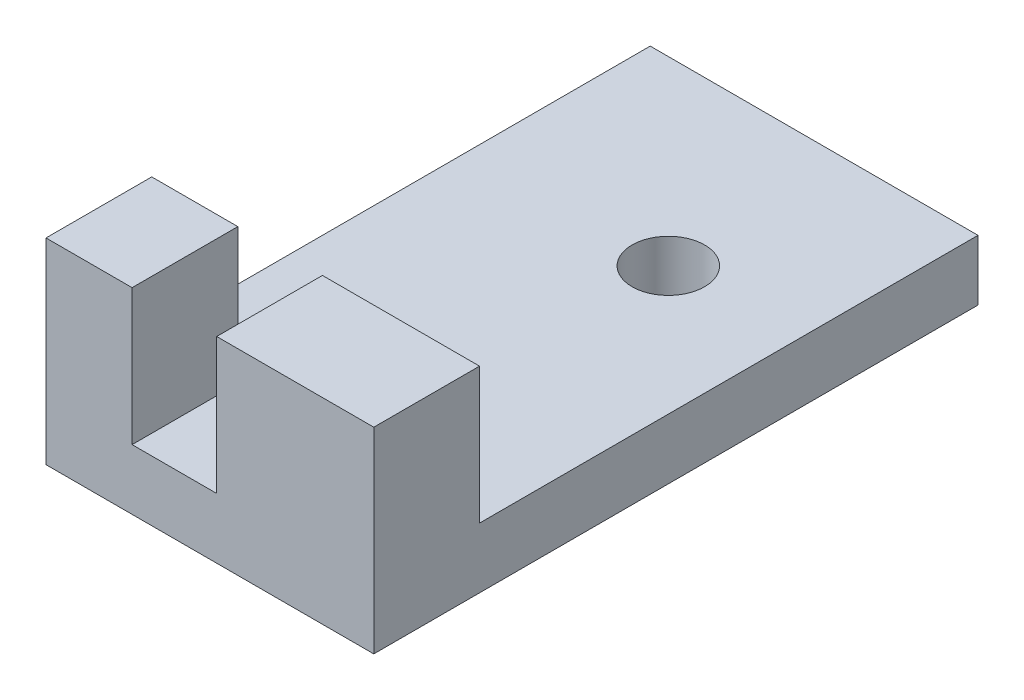
ISO-10303-21;
HEADER;
FILE_DESCRIPTION(('STEP AP214'),'2;1');
FILE_NAME('part.step','',(''),(''),'','','');
FILE_SCHEMA(('AUTOMOTIVE_DESIGN { 1 0 10303 214 1 1 1 1 }'));
ENDSEC;
DATA;
#1=APPLICATION_CONTEXT('core data for automotive mechanical design processes');
#2=APPLICATION_PROTOCOL_DEFINITION('international standard','automotive_design',2000,#1);
#3=PRODUCT_CONTEXT('',#1,'mechanical');
#4=PRODUCT('Part','Part','',(#3));
#5=PRODUCT_RELATED_PRODUCT_CATEGORY('part','',(#4));
#6=PRODUCT_DEFINITION_FORMATION('','',#4);
#7=PRODUCT_DEFINITION_CONTEXT('part definition',#1,'design');
#8=PRODUCT_DEFINITION('design','',#6,#7);
#9=PRODUCT_DEFINITION_SHAPE('','',#8);
#10=(LENGTH_UNIT() NAMED_UNIT(*) SI_UNIT(.MILLI.,.METRE.));
#11=(NAMED_UNIT(*) PLANE_ANGLE_UNIT() SI_UNIT($,.RADIAN.));
#12=(NAMED_UNIT(*) SI_UNIT($,.STERADIAN.) SOLID_ANGLE_UNIT());
#13=UNCERTAINTY_MEASURE_WITH_UNIT(LENGTH_MEASURE(1.E-05),#10,'distance_accuracy_value','');
#14=(GEOMETRIC_REPRESENTATION_CONTEXT(3) GLOBAL_UNCERTAINTY_ASSIGNED_CONTEXT((#13)) GLOBAL_UNIT_ASSIGNED_CONTEXT((#10,
#11,#12)) REPRESENTATION_CONTEXT('',''));
#15=CARTESIAN_POINT('',(0.,0.,0.));
#16=DIRECTION('',(0.,0.,1.));
#17=DIRECTION('',(1.,0.,0.));
#18=AXIS2_PLACEMENT_3D('',#15,#16,#17);
#19=CARTESIAN_POINT('',(0.,13.,0.));
#20=DIRECTION('',(0.,1.,0.));
#21=DIRECTION('',(0.,0.,1.));
#22=AXIS2_PLACEMENT_3D('',#19,#20,#21);
#23=PLANE('',#22);
#24=DIRECTION('',(0.,0.,-1.));
#25=VECTOR('',#24,1.);
#26=CARTESIAN_POINT('',(11.3,13.,40.));
#27=LINE('',#26,#25);
#28=CARTESIAN_POINT('',(11.3,13.,40.));
#29=VERTEX_POINT('',#28);
#30=CARTESIAN_POINT('',(11.3,13.,33.));
#31=VERTEX_POINT('',#30);
#32=EDGE_CURVE('E141',#29,#31,#27,.T.);
#33=ORIENTED_EDGE('',*,*,#32,.F.);
#34=DIRECTION('',(1.,0.,0.));
#35=VECTOR('',#34,1.);
#36=CARTESIAN_POINT('',(0.,13.,40.));
#37=LINE('',#36,#35);
#38=CARTESIAN_POINT('',(21.7,13.,40.));
#39=VERTEX_POINT('',#38);
#40=EDGE_CURVE('E130',#29,#39,#37,.T.);
#41=ORIENTED_EDGE('',*,*,#40,.T.);
#42=DIRECTION('',(0.,0.,-1.));
#43=VECTOR('',#42,1.);
#44=CARTESIAN_POINT('',(21.7,13.,0.));
#45=LINE('',#44,#43);
#46=CARTESIAN_POINT('',(21.7,13.,33.));
#47=VERTEX_POINT('',#46);
#48=EDGE_CURVE('E170',#39,#47,#45,.T.);
#49=ORIENTED_EDGE('',*,*,#48,.T.);
#50=DIRECTION('',(1.,0.,0.));
#51=VECTOR('',#50,1.);
#52=CARTESIAN_POINT('',(0.,13.,33.));
#53=LINE('',#52,#51);
#54=EDGE_CURVE('E143',#31,#47,#53,.T.);
#55=ORIENTED_EDGE('',*,*,#54,.F.);
#56=EDGE_LOOP('',(#33,#41,#49,#55));
#57=FACE_BOUND('',#56,.T.);
#58=ADVANCED_FACE('F32',(#57),#23,.T.);
#59=CARTESIAN_POINT('',(0.,4.,33.));
#60=DIRECTION('',(0.,0.,1.));
#61=DIRECTION('',(1.,0.,0.));
#62=AXIS2_PLACEMENT_3D('',#59,#60,#61);
#63=PLANE('',#62);
#64=DIRECTION('',(1.,0.,0.));
#65=VECTOR('',#64,1.);
#66=CARTESIAN_POINT('',(0.,4.,33.));
#67=LINE('',#66,#65);
#68=CARTESIAN_POINT('',(11.3,4.,33.));
#69=VERTEX_POINT('',#68);
#70=CARTESIAN_POINT('',(21.7,4.,33.));
#71=VERTEX_POINT('',#70);
#72=EDGE_CURVE('E150',#69,#71,#67,.T.);
#73=ORIENTED_EDGE('',*,*,#72,.F.);
#74=DIRECTION('',(0.,-1.,0.));
#75=VECTOR('',#74,1.);
#76=CARTESIAN_POINT('',(11.3,13.,33.));
#77=LINE('',#76,#75);
#78=EDGE_CURVE('E47',#31,#69,#77,.T.);
#79=ORIENTED_EDGE('',*,*,#78,.F.);
#80=ORIENTED_EDGE('',*,*,#54,.T.);
#81=DIRECTION('',(0.,1.,0.));
#82=VECTOR('',#81,1.);
#83=CARTESIAN_POINT('',(21.7,4.,33.));
#84=LINE('',#83,#82);
#85=EDGE_CURVE('E159',#71,#47,#84,.T.);
#86=ORIENTED_EDGE('',*,*,#85,.F.);
#87=EDGE_LOOP('',(#73,#79,#80,#86));
#88=FACE_BOUND('',#87,.T.);
#89=ADVANCED_FACE('F203',(#88),#63,.F.);
#90=CARTESIAN_POINT('',(0.,13.,0.));
#91=DIRECTION('',(0.,0.,1.));
#92=DIRECTION('',(1.,0.,0.));
#93=AXIS2_PLACEMENT_3D('',#90,#91,#92);
#94=PLANE('',#93);
#95=DIRECTION('',(-1.,0.,0.));
#96=VECTOR('',#95,1.);
#97=CARTESIAN_POINT('',(0.,4.,0.));
#98=LINE('',#97,#96);
#99=CARTESIAN_POINT('',(21.7,4.,0.));
#100=VERTEX_POINT('',#99);
#101=CARTESIAN_POINT('',(0.,4.,0.));
#102=VERTEX_POINT('',#101);
#103=EDGE_CURVE('E156',#100,#102,#98,.T.);
#104=ORIENTED_EDGE('',*,*,#103,.F.);
#105=DIRECTION('',(0.,-1.,0.));
#106=VECTOR('',#105,1.);
#107=CARTESIAN_POINT('',(21.7,13.,0.));
#108=LINE('',#107,#106);
#109=CARTESIAN_POINT('',(21.7,0.,0.));
#110=VERTEX_POINT('',#109);
#111=EDGE_CURVE('E184',#100,#110,#108,.T.);
#112=ORIENTED_EDGE('',*,*,#111,.T.);
#113=DIRECTION('',(-1.,0.,0.));
#114=VECTOR('',#113,1.);
#115=CARTESIAN_POINT('',(0.,0.,0.));
#116=LINE('',#115,#114);
#117=CARTESIAN_POINT('',(0.,0.,0.));
#118=VERTEX_POINT('',#117);
#119=EDGE_CURVE('E166',#110,#118,#116,.T.);
#120=ORIENTED_EDGE('',*,*,#119,.T.);
#121=DIRECTION('',(0.,-1.,0.));
#122=VECTOR('',#121,1.);
#123=CARTESIAN_POINT('',(0.,13.,0.));
#124=LINE('',#123,#122);
#125=EDGE_CURVE('E173',#102,#118,#124,.T.);
#126=ORIENTED_EDGE('',*,*,#125,.F.);
#127=EDGE_LOOP('',(#104,#112,#120,#126));
#128=FACE_BOUND('',#127,.T.);
#129=ADVANCED_FACE('F199',(#128),#94,.F.);
#130=CARTESIAN_POINT('',(0.,13.,0.));
#131=DIRECTION('',(1.,0.,0.));
#132=DIRECTION('',(0.,0.,-1.));
#133=AXIS2_PLACEMENT_3D('',#130,#131,#132);
#134=PLANE('',#133);
#135=DIRECTION('',(0.,0.,1.));
#136=VECTOR('',#135,1.);
#137=CARTESIAN_POINT('',(0.,13.,0.));
#138=LINE('',#137,#136);
#139=CARTESIAN_POINT('',(0.,13.,33.));
#140=VERTEX_POINT('',#139);
#141=CARTESIAN_POINT('',(0.,13.,40.));
#142=VERTEX_POINT('',#141);
#143=EDGE_CURVE('E164',#140,#142,#138,.T.);
#144=ORIENTED_EDGE('',*,*,#143,.F.);
#145=DIRECTION('',(0.,1.,0.));
#146=VECTOR('',#145,1.);
#147=CARTESIAN_POINT('',(0.,4.,33.));
#148=LINE('',#147,#146);
#149=CARTESIAN_POINT('',(0.,4.,33.));
#150=VERTEX_POINT('',#149);
#151=EDGE_CURVE('E55',#150,#140,#148,.T.);
#152=ORIENTED_EDGE('',*,*,#151,.F.);
#153=DIRECTION('',(0.,0.,1.));
#154=VECTOR('',#153,1.);
#155=CARTESIAN_POINT('',(0.,4.,0.));
#156=LINE('',#155,#154);
#157=EDGE_CURVE('E148',#102,#150,#156,.T.);
#158=ORIENTED_EDGE('',*,*,#157,.F.);
#159=ORIENTED_EDGE('',*,*,#125,.T.);
#160=DIRECTION('',(0.,0.,1.));
#161=VECTOR('',#160,1.);
#162=CARTESIAN_POINT('',(0.,0.,0.));
#163=LINE('',#162,#161);
#164=CARTESIAN_POINT('',(0.,0.,40.));
#165=VERTEX_POINT('',#164);
#166=EDGE_CURVE('E162',#118,#165,#163,.T.);
#167=ORIENTED_EDGE('',*,*,#166,.T.);
#168=DIRECTION('',(0.,-1.,0.));
#169=VECTOR('',#168,1.);
#170=CARTESIAN_POINT('',(0.,13.,40.));
#171=LINE('',#170,#169);
#172=EDGE_CURVE('E11',#142,#165,#171,.T.);
#173=ORIENTED_EDGE('',*,*,#172,.F.);
#174=EDGE_LOOP('',(#144,#152,#158,#159,#167,#173));
#175=FACE_BOUND('',#174,.T.);
#176=ADVANCED_FACE('F34',(#175),#134,.F.);
#177=CARTESIAN_POINT('',(0.,13.,40.));
#178=DIRECTION('',(0.,0.,-1.));
#179=DIRECTION('',(-1.,0.,0.));
#180=AXIS2_PLACEMENT_3D('',#177,#178,#179);
#181=PLANE('',#180);
#182=ORIENTED_EDGE('',*,*,#40,.F.);
#183=DIRECTION('',(0.,-1.,0.));
#184=VECTOR('',#183,1.);
#185=CARTESIAN_POINT('',(11.3,13.,40.));
#186=LINE('',#185,#184);
#187=CARTESIAN_POINT('',(11.3,4.,40.));
#188=VERTEX_POINT('',#187);
#189=EDGE_CURVE('E111',#29,#188,#186,.T.);
#190=ORIENTED_EDGE('',*,*,#189,.T.);
#191=DIRECTION('',(-1.,0.,0.));
#192=VECTOR('',#191,1.);
#193=CARTESIAN_POINT('',(11.3,4.,40.));
#194=LINE('',#193,#192);
#195=CARTESIAN_POINT('',(5.70000000000001,4.,40.));
#196=VERTEX_POINT('',#195);
#197=EDGE_CURVE('E119',#188,#196,#194,.T.);
#198=ORIENTED_EDGE('',*,*,#197,.T.);
#199=DIRECTION('',(0.,1.,0.));
#200=VECTOR('',#199,1.);
#201=CARTESIAN_POINT('',(5.70000000000001,13.,40.));
#202=LINE('',#201,#200);
#203=CARTESIAN_POINT('',(5.70000000000001,13.,40.));
#204=VERTEX_POINT('',#203);
#205=EDGE_CURVE('E116',#196,#204,#202,.T.);
#206=ORIENTED_EDGE('',*,*,#205,.T.);
#207=EDGE_CURVE('E167',#142,#204,#37,.T.);
#208=ORIENTED_EDGE('',*,*,#207,.F.);
#209=ORIENTED_EDGE('',*,*,#172,.T.);
#210=DIRECTION('',(1.,0.,0.));
#211=VECTOR('',#210,1.);
#212=CARTESIAN_POINT('',(0.,0.,40.));
#213=LINE('',#212,#211);
#214=CARTESIAN_POINT('',(21.7,0.,40.));
#215=VERTEX_POINT('',#214);
#216=EDGE_CURVE('E176',#165,#215,#213,.T.);
#217=ORIENTED_EDGE('',*,*,#216,.T.);
#218=DIRECTION('',(0.,-1.,0.));
#219=VECTOR('',#218,1.);
#220=CARTESIAN_POINT('',(21.7,13.,40.));
#221=LINE('',#220,#219);
#222=EDGE_CURVE('E40',#39,#215,#221,.T.);
#223=ORIENTED_EDGE('',*,*,#222,.F.);
#224=EDGE_LOOP('',(#182,#190,#198,#206,#208,#209,#217,#223));
#225=FACE_BOUND('',#224,.T.);
#226=ADVANCED_FACE('F128',(#225),#181,.F.);
#227=CARTESIAN_POINT('',(21.7,13.,0.));
#228=DIRECTION('',(-1.,0.,0.));
#229=DIRECTION('',(0.,0.,1.));
#230=AXIS2_PLACEMENT_3D('',#227,#228,#229);
#231=PLANE('',#230);
#232=DIRECTION('',(0.,0.,-1.));
#233=VECTOR('',#232,1.);
#234=CARTESIAN_POINT('',(21.7,4.,0.));
#235=LINE('',#234,#233);
#236=EDGE_CURVE('E154',#71,#100,#235,.T.);
#237=ORIENTED_EDGE('',*,*,#236,.F.);
#238=ORIENTED_EDGE('',*,*,#85,.T.);
#239=ORIENTED_EDGE('',*,*,#48,.F.);
#240=ORIENTED_EDGE('',*,*,#222,.T.);
#241=DIRECTION('',(0.,0.,-1.));
#242=VECTOR('',#241,1.);
#243=CARTESIAN_POINT('',(21.7,0.,0.));
#244=LINE('',#243,#242);
#245=EDGE_CURVE('E178',#215,#110,#244,.T.);
#246=ORIENTED_EDGE('',*,*,#245,.T.);
#247=ORIENTED_EDGE('',*,*,#111,.F.);
#248=EDGE_LOOP('',(#237,#238,#239,#240,#246,#247));
#249=FACE_BOUND('',#248,.T.);
#250=ADVANCED_FACE('F190',(#249),#231,.F.);
#251=DIRECTION('',(0.,0.,-1.));
#252=VECTOR('',#251,1.);
#253=CARTESIAN_POINT('',(5.70000000000001,13.,40.));
#254=LINE('',#253,#252);
#255=CARTESIAN_POINT('',(5.70000000000001,13.,33.));
#256=VERTEX_POINT('',#255);
#257=EDGE_CURVE('E144',#204,#256,#254,.T.);
#258=ORIENTED_EDGE('',*,*,#257,.T.);
#259=EDGE_CURVE('E151',#140,#256,#53,.T.);
#260=ORIENTED_EDGE('',*,*,#259,.F.);
#261=ORIENTED_EDGE('',*,*,#143,.T.);
#262=ORIENTED_EDGE('',*,*,#207,.T.);
#263=EDGE_LOOP('',(#258,#260,#261,#262));
#264=FACE_BOUND('',#263,.T.);
#265=ADVANCED_FACE('F208',(#264),#23,.T.);
#266=CARTESIAN_POINT('',(0.,0.,0.));
#267=DIRECTION('',(0.,1.,0.));
#268=DIRECTION('',(0.,0.,1.));
#269=AXIS2_PLACEMENT_3D('',#266,#267,#268);
#270=PLANE('',#269);
#271=CARTESIAN_POINT('',(13.2,0.,12.));
#272=DIRECTION('',(0.,1.,0.));
#273=DIRECTION('',(0.,0.,1.));
#274=AXIS2_PLACEMENT_3D('',#271,#272,#273);
#275=CIRCLE('',#274,2.4);
#276=CARTESIAN_POINT('',(13.2,0.,14.4));
#277=VERTEX_POINT('',#276);
#278=EDGE_CURVE('E139',#277,#277,#275,.T.);
#279=ORIENTED_EDGE('',*,*,#278,.T.);
#280=EDGE_LOOP('',(#279));
#281=FACE_BOUND('',#280,.T.);
#282=ORIENTED_EDGE('',*,*,#166,.F.);
#283=ORIENTED_EDGE('',*,*,#119,.F.);
#284=ORIENTED_EDGE('',*,*,#245,.F.);
#285=ORIENTED_EDGE('',*,*,#216,.F.);
#286=EDGE_LOOP('',(#282,#283,#284,#285));
#287=FACE_BOUND('',#286,.T.);
#288=ADVANCED_FACE('F195',(#281,#287),#270,.F.);
#289=ORIENTED_EDGE('',*,*,#259,.T.);
#290=DIRECTION('',(0.,1.,0.));
#291=VECTOR('',#290,1.);
#292=CARTESIAN_POINT('',(5.70000000000001,13.,33.));
#293=LINE('',#292,#291);
#294=CARTESIAN_POINT('',(5.70000000000001,4.,33.));
#295=VERTEX_POINT('',#294);
#296=EDGE_CURVE('E131',#295,#256,#293,.T.);
#297=ORIENTED_EDGE('',*,*,#296,.F.);
#298=EDGE_CURVE('E152',#150,#295,#67,.T.);
#299=ORIENTED_EDGE('',*,*,#298,.F.);
#300=ORIENTED_EDGE('',*,*,#151,.T.);
#301=EDGE_LOOP('',(#289,#297,#299,#300));
#302=FACE_BOUND('',#301,.T.);
#303=ADVANCED_FACE('F213',(#302),#63,.F.);
#304=CARTESIAN_POINT('',(0.,4.,0.));
#305=DIRECTION('',(0.,1.,0.));
#306=DIRECTION('',(0.,0.,1.));
#307=AXIS2_PLACEMENT_3D('',#304,#305,#306);
#308=PLANE('',#307);
#309=CARTESIAN_POINT('',(13.2,4.,12.));
#310=DIRECTION('',(0.,1.,0.));
#311=DIRECTION('',(0.,0.,1.));
#312=AXIS2_PLACEMENT_3D('',#309,#310,#311);
#313=CIRCLE('',#312,2.4);
#314=CARTESIAN_POINT('',(13.2,4.,14.4));
#315=VERTEX_POINT('',#314);
#316=EDGE_CURVE('E135',#315,#315,#313,.T.);
#317=ORIENTED_EDGE('',*,*,#316,.F.);
#318=EDGE_LOOP('',(#317));
#319=FACE_BOUND('',#318,.T.);
#320=ORIENTED_EDGE('',*,*,#157,.T.);
#321=ORIENTED_EDGE('',*,*,#298,.T.);
#322=DIRECTION('',(0.,0.,-1.));
#323=VECTOR('',#322,1.);
#324=CARTESIAN_POINT('',(5.70000000000001,4.,40.));
#325=LINE('',#324,#323);
#326=EDGE_CURVE('E115',#196,#295,#325,.T.);
#327=ORIENTED_EDGE('',*,*,#326,.F.);
#328=ORIENTED_EDGE('',*,*,#197,.F.);
#329=DIRECTION('',(0.,0.,-1.));
#330=VECTOR('',#329,1.);
#331=CARTESIAN_POINT('',(11.3,4.,40.));
#332=LINE('',#331,#330);
#333=EDGE_CURVE('E107',#188,#69,#332,.T.);
#334=ORIENTED_EDGE('',*,*,#333,.T.);
#335=ORIENTED_EDGE('',*,*,#72,.T.);
#336=ORIENTED_EDGE('',*,*,#236,.T.);
#337=ORIENTED_EDGE('',*,*,#103,.T.);
#338=EDGE_LOOP('',(#320,#321,#327,#328,#334,#335,#336,#337));
#339=FACE_BOUND('',#338,.T.);
#340=ADVANCED_FACE('F121',(#319,#339),#308,.T.);
#341=CARTESIAN_POINT('',(11.3,13.,40.));
#342=DIRECTION('',(1.,0.,0.));
#343=DIRECTION('',(0.,1.,0.));
#344=AXIS2_PLACEMENT_3D('',#341,#342,#343);
#345=PLANE('',#344);
#346=ORIENTED_EDGE('',*,*,#78,.T.);
#347=ORIENTED_EDGE('',*,*,#333,.F.);
#348=ORIENTED_EDGE('',*,*,#189,.F.);
#349=ORIENTED_EDGE('',*,*,#32,.T.);
#350=EDGE_LOOP('',(#346,#347,#348,#349));
#351=FACE_BOUND('',#350,.T.);
#352=ADVANCED_FACE('F109',(#351),#345,.F.);
#353=CARTESIAN_POINT('',(5.70000000000001,13.,40.));
#354=DIRECTION('',(-1.,0.,0.));
#355=DIRECTION('',(0.,-1.,0.));
#356=AXIS2_PLACEMENT_3D('',#353,#354,#355);
#357=PLANE('',#356);
#358=ORIENTED_EDGE('',*,*,#296,.T.);
#359=ORIENTED_EDGE('',*,*,#257,.F.);
#360=ORIENTED_EDGE('',*,*,#205,.F.);
#361=ORIENTED_EDGE('',*,*,#326,.T.);
#362=EDGE_LOOP('',(#358,#359,#360,#361));
#363=FACE_BOUND('',#362,.T.);
#364=ADVANCED_FACE('F229',(#363),#357,.F.);
#365=CARTESIAN_POINT('',(13.2,0.,12.));
#366=DIRECTION('',(0.,1.,0.));
#367=DIRECTION('',(0.,0.,1.));
#368=AXIS2_PLACEMENT_3D('',#365,#366,#367);
#369=CYLINDRICAL_SURFACE('',#368,2.4);
#370=ORIENTED_EDGE('',*,*,#278,.F.);
#371=EDGE_LOOP('',(#370));
#372=FACE_BOUND('',#371,.T.);
#373=ORIENTED_EDGE('',*,*,#316,.T.);
#374=EDGE_LOOP('',(#373));
#375=FACE_BOUND('',#374,.T.);
#376=ADVANCED_FACE('F231',(#372,#375),#369,.F.);
#377=CLOSED_SHELL('',(#58,#89,#129,#176,#226,#250,#265,#288,#303,#340,#352,#364,#376));
#378=MANIFOLD_SOLID_BREP('B2',#377);
#379=ADVANCED_BREP_SHAPE_REPRESENTATION('',(#18,#378),#14);
#380=SHAPE_DEFINITION_REPRESENTATION(#9,#379);
ENDSEC;
END-ISO-10303-21;
